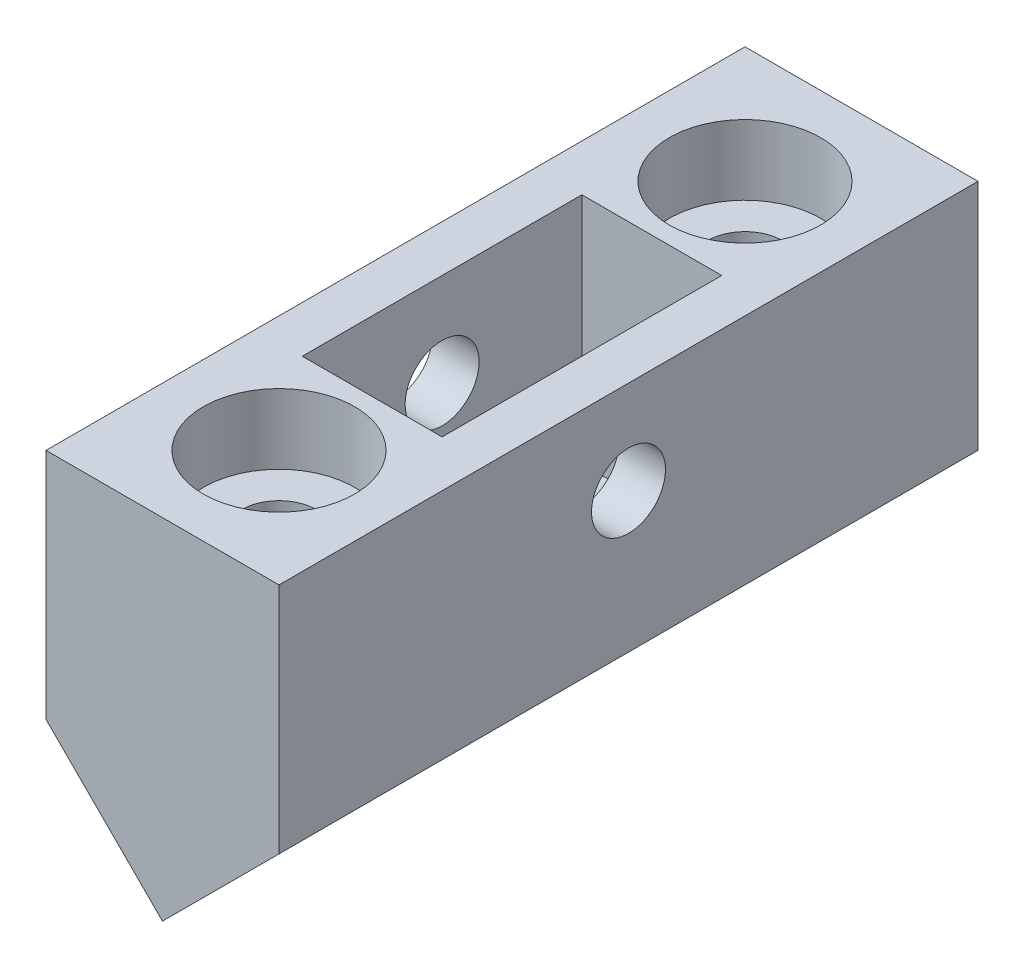
ISO-10303-21;
HEADER;
FILE_DESCRIPTION(('STEP AP214'),'2;1');
FILE_NAME('part.step','',(''),(''),'','','');
FILE_SCHEMA(('AUTOMOTIVE_DESIGN { 1 0 10303 214 1 1 1 1 }'));
ENDSEC;
DATA;
#1=APPLICATION_CONTEXT('core data for automotive mechanical design processes');
#2=APPLICATION_PROTOCOL_DEFINITION('international standard','automotive_design',2000,#1);
#3=PRODUCT_CONTEXT('',#1,'mechanical');
#4=PRODUCT('Part','Part','',(#3));
#5=PRODUCT_RELATED_PRODUCT_CATEGORY('part','',(#4));
#6=PRODUCT_DEFINITION_FORMATION('','',#4);
#7=PRODUCT_DEFINITION_CONTEXT('part definition',#1,'design');
#8=PRODUCT_DEFINITION('design','',#6,#7);
#9=PRODUCT_DEFINITION_SHAPE('','',#8);
#10=(LENGTH_UNIT() NAMED_UNIT(*) SI_UNIT(.MILLI.,.METRE.));
#11=(NAMED_UNIT(*) PLANE_ANGLE_UNIT() SI_UNIT($,.RADIAN.));
#12=(NAMED_UNIT(*) SI_UNIT($,.STERADIAN.) SOLID_ANGLE_UNIT());
#13=UNCERTAINTY_MEASURE_WITH_UNIT(LENGTH_MEASURE(1.E-05),#10,'distance_accuracy_value','');
#14=(GEOMETRIC_REPRESENTATION_CONTEXT(3) GLOBAL_UNCERTAINTY_ASSIGNED_CONTEXT((#13)) GLOBAL_UNIT_ASSIGNED_CONTEXT((#10,
#11,#12)) REPRESENTATION_CONTEXT('',''));
#15=CARTESIAN_POINT('',(0.,0.,0.));
#16=DIRECTION('',(0.,0.,1.));
#17=DIRECTION('',(1.,0.,0.));
#18=AXIS2_PLACEMENT_3D('',#15,#16,#17);
#19=CARTESIAN_POINT('',(0.,-10.,-15.));
#20=DIRECTION('',(0.707106781186549,-0.707106781186547,0.));
#21=DIRECTION('',(0.707106781186547,0.707106781186549,0.));
#22=AXIS2_PLACEMENT_3D('',#19,#20,#21);
#23=PLANE('',#22);
#24=CARTESIAN_POINT('',(0.,-10.,10.));
#25=DIRECTION('',(0.707106781186549,-0.707106781186547,0.));
#26=DIRECTION('',(0.707106781186547,0.707106781186549,0.));
#27=AXIS2_PLACEMENT_3D('',#24,#25,#26);
#28=ELLIPSE('',#27,2.26274169979695,1.6);
#29=CARTESIAN_POINT('',(0.,-10.,8.4));
#30=VERTEX_POINT('',#29);
#31=CARTESIAN_POINT('',(0.,-10.,11.6));
#32=VERTEX_POINT('',#31);
#33=EDGE_CURVE('E47',#30,#32,#28,.T.);
#34=ORIENTED_EDGE('',*,*,#33,.F.);
#35=DIRECTION('',(0.,0.,1.));
#36=VECTOR('',#35,1.);
#37=CARTESIAN_POINT('',(0.,-10.,-15.));
#38=LINE('',#37,#36);
#39=CARTESIAN_POINT('',(0.,-10.,-8.4));
#40=VERTEX_POINT('',#39);
#41=EDGE_CURVE('E120',#40,#30,#38,.T.);
#42=ORIENTED_EDGE('',*,*,#41,.F.);
#43=CARTESIAN_POINT('',(0.,-10.,-10.));
#44=DIRECTION('',(0.707106781186549,-0.707106781186547,0.));
#45=DIRECTION('',(0.707106781186547,0.707106781186549,0.));
#46=AXIS2_PLACEMENT_3D('',#43,#44,#45);
#47=ELLIPSE('',#46,2.26274169979695,1.6);
#48=CARTESIAN_POINT('',(0.,-10.,-11.6));
#49=VERTEX_POINT('',#48);
#50=EDGE_CURVE('E42',#49,#40,#47,.T.);
#51=ORIENTED_EDGE('',*,*,#50,.F.);
#52=CARTESIAN_POINT('',(0.,-10.,-15.));
#53=VERTEX_POINT('',#52);
#54=EDGE_CURVE('E128',#53,#49,#38,.T.);
#55=ORIENTED_EDGE('',*,*,#54,.F.);
#56=DIRECTION('',(0.707106781186547,0.707106781186549,0.));
#57=VECTOR('',#56,1.);
#58=CARTESIAN_POINT('',(0.,-10.,-15.));
#59=LINE('',#58,#57);
#60=CARTESIAN_POINT('',(5.,-5.,-15.));
#61=VERTEX_POINT('',#60);
#62=EDGE_CURVE('E165',#53,#61,#59,.T.);
#63=ORIENTED_EDGE('',*,*,#62,.T.);
#64=DIRECTION('',(0.,0.,1.));
#65=VECTOR('',#64,1.);
#66=CARTESIAN_POINT('',(5.,-5.,-15.));
#67=LINE('',#66,#65);
#68=CARTESIAN_POINT('',(5.,-5.,15.));
#69=VERTEX_POINT('',#68);
#70=EDGE_CURVE('E140',#61,#69,#67,.T.);
#71=ORIENTED_EDGE('',*,*,#70,.T.);
#72=DIRECTION('',(0.707106781186547,0.707106781186549,0.));
#73=VECTOR('',#72,1.);
#74=CARTESIAN_POINT('',(0.,-10.,15.));
#75=LINE('',#74,#73);
#76=CARTESIAN_POINT('',(0.,-10.,15.));
#77=VERTEX_POINT('',#76);
#78=EDGE_CURVE('E179',#77,#69,#75,.T.);
#79=ORIENTED_EDGE('',*,*,#78,.F.);
#80=EDGE_CURVE('E122',#32,#77,#38,.T.);
#81=ORIENTED_EDGE('',*,*,#80,.F.);
#82=EDGE_LOOP('',(#34,#42,#51,#55,#63,#71,#79,#81));
#83=FACE_BOUND('',#82,.T.);
#84=ADVANCED_FACE('F35',(#83),#23,.T.);
#85=CARTESIAN_POINT('',(-5.,-5.,-15.));
#86=DIRECTION('',(-0.707106781186548,-0.707106781186547,0.));
#87=DIRECTION('',(0.707106781186547,-0.707106781186548,0.));
#88=AXIS2_PLACEMENT_3D('',#85,#86,#87);
#89=PLANE('',#88);
#90=CARTESIAN_POINT('',(0.,-10.,10.));
#91=DIRECTION('',(-0.707106781186548,-0.707106781186547,0.));
#92=DIRECTION('',(-0.707106781186547,0.707106781186548,0.));
#93=AXIS2_PLACEMENT_3D('',#90,#91,#92);
#94=ELLIPSE('',#93,2.26274169979695,1.6);
#95=EDGE_CURVE('E11',#32,#30,#94,.T.);
#96=ORIENTED_EDGE('',*,*,#95,.F.);
#97=ORIENTED_EDGE('',*,*,#80,.T.);
#98=DIRECTION('',(0.707106781186547,-0.707106781186548,0.));
#99=VECTOR('',#98,1.);
#100=CARTESIAN_POINT('',(-5.,-5.,15.));
#101=LINE('',#100,#99);
#102=CARTESIAN_POINT('',(-5.,-5.,15.));
#103=VERTEX_POINT('',#102);
#104=EDGE_CURVE('E167',#103,#77,#101,.T.);
#105=ORIENTED_EDGE('',*,*,#104,.F.);
#106=DIRECTION('',(0.,0.,1.));
#107=VECTOR('',#106,1.);
#108=CARTESIAN_POINT('',(-5.,-5.,-15.));
#109=LINE('',#108,#107);
#110=CARTESIAN_POINT('',(-5.,-5.,-15.));
#111=VERTEX_POINT('',#110);
#112=EDGE_CURVE('E130',#111,#103,#109,.T.);
#113=ORIENTED_EDGE('',*,*,#112,.F.);
#114=DIRECTION('',(0.707106781186547,-0.707106781186548,0.));
#115=VECTOR('',#114,1.);
#116=CARTESIAN_POINT('',(-5.,-5.,-15.));
#117=LINE('',#116,#115);
#118=EDGE_CURVE('E133',#111,#53,#117,.T.);
#119=ORIENTED_EDGE('',*,*,#118,.T.);
#120=ORIENTED_EDGE('',*,*,#54,.T.);
#121=CARTESIAN_POINT('',(0.,-10.,-10.));
#122=DIRECTION('',(-0.707106781186548,-0.707106781186547,0.));
#123=DIRECTION('',(-0.707106781186547,0.707106781186548,0.));
#124=AXIS2_PLACEMENT_3D('',#121,#122,#123);
#125=ELLIPSE('',#124,2.26274169979695,1.6);
#126=EDGE_CURVE('E54',#40,#49,#125,.T.);
#127=ORIENTED_EDGE('',*,*,#126,.F.);
#128=ORIENTED_EDGE('',*,*,#41,.T.);
#129=EDGE_LOOP('',(#96,#97,#105,#113,#119,#120,#127,#128));
#130=FACE_BOUND('',#129,.T.);
#131=ADVANCED_FACE('F126',(#130),#89,.T.);
#132=CARTESIAN_POINT('',(-5.,5.,-15.));
#133=DIRECTION('',(-1.,0.,0.));
#134=DIRECTION('',(0.,0.,1.));
#135=AXIS2_PLACEMENT_3D('',#132,#133,#134);
#136=PLANE('',#135);
#137=CARTESIAN_POINT('',(-5.,1.,0.));
#138=DIRECTION('',(1.,0.,0.));
#139=DIRECTION('',(0.,1.,0.));
#140=AXIS2_PLACEMENT_3D('',#137,#138,#139);
#141=CIRCLE('',#140,1.5875);
#142=CARTESIAN_POINT('',(-5.,2.5875,0.));
#143=VERTEX_POINT('',#142);
#144=EDGE_CURVE('E145',#143,#143,#141,.T.);
#145=ORIENTED_EDGE('',*,*,#144,.T.);
#146=EDGE_LOOP('',(#145));
#147=FACE_BOUND('',#146,.T.);
#148=ORIENTED_EDGE('',*,*,#112,.T.);
#149=DIRECTION('',(0.,-1.,0.));
#150=VECTOR('',#149,1.);
#151=CARTESIAN_POINT('',(-5.,5.,15.));
#152=LINE('',#151,#150);
#153=CARTESIAN_POINT('',(-5.,5.,15.));
#154=VERTEX_POINT('',#153);
#155=EDGE_CURVE('E170',#154,#103,#152,.T.);
#156=ORIENTED_EDGE('',*,*,#155,.F.);
#157=DIRECTION('',(0.,0.,1.));
#158=VECTOR('',#157,1.);
#159=CARTESIAN_POINT('',(-5.,5.,-15.));
#160=LINE('',#159,#158);
#161=CARTESIAN_POINT('',(-5.,5.,-15.));
#162=VERTEX_POINT('',#161);
#163=EDGE_CURVE('E136',#162,#154,#160,.T.);
#164=ORIENTED_EDGE('',*,*,#163,.F.);
#165=DIRECTION('',(0.,-1.,0.));
#166=VECTOR('',#165,1.);
#167=CARTESIAN_POINT('',(-5.,5.,-15.));
#168=LINE('',#167,#166);
#169=EDGE_CURVE('E156',#162,#111,#168,.T.);
#170=ORIENTED_EDGE('',*,*,#169,.T.);
#171=EDGE_LOOP('',(#148,#156,#164,#170));
#172=FACE_BOUND('',#171,.T.);
#173=ADVANCED_FACE('F245',(#147,#172),#136,.T.);
#174=CARTESIAN_POINT('',(-5.,5.,-15.));
#175=DIRECTION('',(0.,1.,0.));
#176=DIRECTION('',(-1.,0.,0.));
#177=AXIS2_PLACEMENT_3D('',#174,#175,#176);
#178=PLANE('',#177);
#179=CARTESIAN_POINT('',(0.,5.,10.));
#180=DIRECTION('',(0.,1.,0.));
#181=DIRECTION('',(0.,0.,1.));
#182=AXIS2_PLACEMENT_3D('',#179,#180,#181);
#183=CIRCLE('',#182,3.25);
#184=CARTESIAN_POINT('',(0.,5.,13.25));
#185=VERTEX_POINT('',#184);
#186=EDGE_CURVE('E235',#185,#185,#183,.T.);
#187=ORIENTED_EDGE('',*,*,#186,.F.);
#188=EDGE_LOOP('',(#187));
#189=FACE_BOUND('',#188,.T.);
#190=CARTESIAN_POINT('',(0.,5.,-10.));
#191=DIRECTION('',(0.,1.,0.));
#192=DIRECTION('',(0.,0.,1.));
#193=AXIS2_PLACEMENT_3D('',#190,#191,#192);
#194=CIRCLE('',#193,3.25);
#195=CARTESIAN_POINT('',(0.,5.,-6.75));
#196=VERTEX_POINT('',#195);
#197=EDGE_CURVE('E123',#196,#196,#194,.T.);
#198=ORIENTED_EDGE('',*,*,#197,.F.);
#199=EDGE_LOOP('',(#198));
#200=FACE_BOUND('',#199,.T.);
#201=DIRECTION('',(0.,0.,-1.));
#202=VECTOR('',#201,1.);
#203=CARTESIAN_POINT('',(3.,5.00000000000001,-6.));
#204=LINE('',#203,#202);
#205=CARTESIAN_POINT('',(3.,5.00000000000001,6.));
#206=VERTEX_POINT('',#205);
#207=CARTESIAN_POINT('',(3.00000000000001,5.,-6.));
#208=VERTEX_POINT('',#207);
#209=EDGE_CURVE('E202',#206,#208,#204,.T.);
#210=ORIENTED_EDGE('',*,*,#209,.F.);
#211=DIRECTION('',(1.,0.,0.));
#212=VECTOR('',#211,1.);
#213=CARTESIAN_POINT('',(-3.,5.,6.));
#214=LINE('',#213,#212);
#215=CARTESIAN_POINT('',(-3.,5.,6.));
#216=VERTEX_POINT('',#215);
#217=EDGE_CURVE('E192',#216,#206,#214,.T.);
#218=ORIENTED_EDGE('',*,*,#217,.F.);
#219=DIRECTION('',(0.,0.,1.));
#220=VECTOR('',#219,1.);
#221=CARTESIAN_POINT('',(-3.,5.,-6.));
#222=LINE('',#221,#220);
#223=CARTESIAN_POINT('',(-3.,5.,-6.));
#224=VERTEX_POINT('',#223);
#225=EDGE_CURVE('E196',#224,#216,#222,.T.);
#226=ORIENTED_EDGE('',*,*,#225,.F.);
#227=DIRECTION('',(-1.,0.,0.));
#228=VECTOR('',#227,1.);
#229=CARTESIAN_POINT('',(-3.,5.,-6.));
#230=LINE('',#229,#228);
#231=EDGE_CURVE('E199',#208,#224,#230,.T.);
#232=ORIENTED_EDGE('',*,*,#231,.F.);
#233=EDGE_LOOP('',(#210,#218,#226,#232));
#234=FACE_BOUND('',#233,.T.);
#235=ORIENTED_EDGE('',*,*,#163,.T.);
#236=DIRECTION('',(-1.,0.,0.));
#237=VECTOR('',#236,1.);
#238=CARTESIAN_POINT('',(-5.,5.,15.));
#239=LINE('',#238,#237);
#240=CARTESIAN_POINT('',(5.,5.,15.));
#241=VERTEX_POINT('',#240);
#242=EDGE_CURVE('E173',#241,#154,#239,.T.);
#243=ORIENTED_EDGE('',*,*,#242,.F.);
#244=DIRECTION('',(0.,0.,1.));
#245=VECTOR('',#244,1.);
#246=CARTESIAN_POINT('',(5.,5.,-15.));
#247=LINE('',#246,#245);
#248=CARTESIAN_POINT('',(5.,5.,-15.));
#249=VERTEX_POINT('',#248);
#250=EDGE_CURVE('E138',#249,#241,#247,.T.);
#251=ORIENTED_EDGE('',*,*,#250,.F.);
#252=DIRECTION('',(-1.,0.,0.));
#253=VECTOR('',#252,1.);
#254=CARTESIAN_POINT('',(-5.,5.,-15.));
#255=LINE('',#254,#253);
#256=EDGE_CURVE('E157',#249,#162,#255,.T.);
#257=ORIENTED_EDGE('',*,*,#256,.T.);
#258=EDGE_LOOP('',(#235,#243,#251,#257));
#259=FACE_BOUND('',#258,.T.);
#260=ADVANCED_FACE('F241',(#189,#200,#234,#259),#178,.T.);
#261=CARTESIAN_POINT('',(5.,5.,-15.));
#262=DIRECTION('',(1.,0.,0.));
#263=DIRECTION('',(0.,0.,-1.));
#264=AXIS2_PLACEMENT_3D('',#261,#262,#263);
#265=PLANE('',#264);
#266=CARTESIAN_POINT('',(5.,1.,0.));
#267=DIRECTION('',(1.,0.,0.));
#268=DIRECTION('',(0.,1.,0.));
#269=AXIS2_PLACEMENT_3D('',#266,#267,#268);
#270=CIRCLE('',#269,1.5875);
#271=CARTESIAN_POINT('',(5.,2.5875,0.));
#272=VERTEX_POINT('',#271);
#273=EDGE_CURVE('E216',#272,#272,#270,.T.);
#274=ORIENTED_EDGE('',*,*,#273,.F.);
#275=EDGE_LOOP('',(#274));
#276=FACE_BOUND('',#275,.T.);
#277=ORIENTED_EDGE('',*,*,#250,.T.);
#278=DIRECTION('',(0.,1.,0.));
#279=VECTOR('',#278,1.);
#280=CARTESIAN_POINT('',(5.,5.,15.));
#281=LINE('',#280,#279);
#282=EDGE_CURVE('E176',#69,#241,#281,.T.);
#283=ORIENTED_EDGE('',*,*,#282,.F.);
#284=ORIENTED_EDGE('',*,*,#70,.F.);
#285=DIRECTION('',(0.,1.,0.));
#286=VECTOR('',#285,1.);
#287=CARTESIAN_POINT('',(5.,5.,-15.));
#288=LINE('',#287,#286);
#289=EDGE_CURVE('E160',#61,#249,#288,.T.);
#290=ORIENTED_EDGE('',*,*,#289,.T.);
#291=EDGE_LOOP('',(#277,#283,#284,#290));
#292=FACE_BOUND('',#291,.T.);
#293=ADVANCED_FACE('F244',(#276,#292),#265,.T.);
#294=CARTESIAN_POINT('',(0.,0.,-15.));
#295=DIRECTION('',(0.,0.,-1.));
#296=DIRECTION('',(-1.,0.,0.));
#297=AXIS2_PLACEMENT_3D('',#294,#295,#296);
#298=PLANE('',#297);
#299=ORIENTED_EDGE('',*,*,#62,.F.);
#300=ORIENTED_EDGE('',*,*,#118,.F.);
#301=ORIENTED_EDGE('',*,*,#169,.F.);
#302=ORIENTED_EDGE('',*,*,#256,.F.);
#303=ORIENTED_EDGE('',*,*,#289,.F.);
#304=EDGE_LOOP('',(#299,#300,#301,#302,#303));
#305=FACE_BOUND('',#304,.T.);
#306=ADVANCED_FACE('F372',(#305),#298,.T.);
#307=CARTESIAN_POINT('',(0.,0.,15.));
#308=DIRECTION('',(0.,0.,-1.));
#309=DIRECTION('',(-1.,0.,0.));
#310=AXIS2_PLACEMENT_3D('',#307,#308,#309);
#311=PLANE('',#310);
#312=ORIENTED_EDGE('',*,*,#78,.T.);
#313=ORIENTED_EDGE('',*,*,#282,.T.);
#314=ORIENTED_EDGE('',*,*,#242,.T.);
#315=ORIENTED_EDGE('',*,*,#155,.T.);
#316=ORIENTED_EDGE('',*,*,#104,.T.);
#317=EDGE_LOOP('',(#312,#313,#314,#315,#316));
#318=FACE_BOUND('',#317,.T.);
#319=ADVANCED_FACE('F257',(#318),#311,.F.);
#320=CARTESIAN_POINT('',(3.00000000000001,-4.99999999999999,-6.));
#321=DIRECTION('',(1.,0.,0.));
#322=DIRECTION('',(0.,1.,0.));
#323=AXIS2_PLACEMENT_3D('',#320,#321,#322);
#324=PLANE('',#323);
#325=CARTESIAN_POINT('',(3.,1.,0.));
#326=DIRECTION('',(1.,0.,0.));
#327=DIRECTION('',(0.,1.,0.));
#328=AXIS2_PLACEMENT_3D('',#325,#326,#327);
#329=CIRCLE('',#328,1.5875);
#330=CARTESIAN_POINT('',(3.,2.5875,0.));
#331=VERTEX_POINT('',#330);
#332=EDGE_CURVE('E144',#331,#331,#329,.T.);
#333=ORIENTED_EDGE('',*,*,#332,.T.);
#334=EDGE_LOOP('',(#333));
#335=FACE_BOUND('',#334,.T.);
#336=ORIENTED_EDGE('',*,*,#209,.T.);
#337=DIRECTION('',(0.,1.,0.));
#338=VECTOR('',#337,1.);
#339=CARTESIAN_POINT('',(3.00000000000001,-4.99999999999999,-6.));
#340=LINE('',#339,#338);
#341=CARTESIAN_POINT('',(3.00000000000001,-4.99999999999999,-6.));
#342=VERTEX_POINT('',#341);
#343=EDGE_CURVE('E183',#342,#208,#340,.T.);
#344=ORIENTED_EDGE('',*,*,#343,.F.);
#345=DIRECTION('',(0.,0.,-1.));
#346=VECTOR('',#345,1.);
#347=CARTESIAN_POINT('',(3.00000000000001,-4.99999999999999,-6.));
#348=LINE('',#347,#346);
#349=CARTESIAN_POINT('',(3.00000000000001,-4.99999999999999,6.));
#350=VERTEX_POINT('',#349);
#351=EDGE_CURVE('E195',#350,#342,#348,.T.);
#352=ORIENTED_EDGE('',*,*,#351,.F.);
#353=DIRECTION('',(0.,1.,0.));
#354=VECTOR('',#353,1.);
#355=CARTESIAN_POINT('',(3.00000000000001,-4.99999999999999,6.));
#356=LINE('',#355,#354);
#357=EDGE_CURVE('E182',#350,#206,#356,.T.);
#358=ORIENTED_EDGE('',*,*,#357,.T.);
#359=EDGE_LOOP('',(#336,#344,#352,#358));
#360=FACE_BOUND('',#359,.T.);
#361=ADVANCED_FACE('F359',(#335,#360),#324,.F.);
#362=CARTESIAN_POINT('',(-2.99999999999999,-5.,6.));
#363=DIRECTION('',(0.,0.,1.));
#364=DIRECTION('',(1.,0.,0.));
#365=AXIS2_PLACEMENT_3D('',#362,#363,#364);
#366=PLANE('',#365);
#367=ORIENTED_EDGE('',*,*,#217,.T.);
#368=ORIENTED_EDGE('',*,*,#357,.F.);
#369=DIRECTION('',(1.,0.,0.));
#370=VECTOR('',#369,1.);
#371=CARTESIAN_POINT('',(-2.99999999999999,-5.,6.));
#372=LINE('',#371,#370);
#373=CARTESIAN_POINT('',(-2.99999999999999,-5.,6.));
#374=VERTEX_POINT('',#373);
#375=EDGE_CURVE('E187',#374,#350,#372,.T.);
#376=ORIENTED_EDGE('',*,*,#375,.F.);
#377=DIRECTION('',(0.,1.,0.));
#378=VECTOR('',#377,1.);
#379=CARTESIAN_POINT('',(-2.99999999999999,-5.,6.));
#380=LINE('',#379,#378);
#381=EDGE_CURVE('E189',#374,#216,#380,.T.);
#382=ORIENTED_EDGE('',*,*,#381,.T.);
#383=EDGE_LOOP('',(#367,#368,#376,#382));
#384=FACE_BOUND('',#383,.T.);
#385=ADVANCED_FACE('F355',(#384),#366,.F.);
#386=CARTESIAN_POINT('',(-2.99999999999999,-5.,-6.));
#387=DIRECTION('',(-1.,0.,0.));
#388=DIRECTION('',(0.,-1.,0.));
#389=AXIS2_PLACEMENT_3D('',#386,#387,#388);
#390=PLANE('',#389);
#391=CARTESIAN_POINT('',(-3.,1.,0.));
#392=DIRECTION('',(-1.,0.,0.));
#393=DIRECTION('',(0.,-1.,0.));
#394=AXIS2_PLACEMENT_3D('',#391,#392,#393);
#395=CIRCLE('',#394,1.5875);
#396=CARTESIAN_POINT('',(-2.99999999999999,-0.587499999999997,0.));
#397=VERTEX_POINT('',#396);
#398=EDGE_CURVE('E142',#397,#397,#395,.T.);
#399=ORIENTED_EDGE('',*,*,#398,.T.);
#400=EDGE_LOOP('',(#399));
#401=FACE_BOUND('',#400,.T.);
#402=ORIENTED_EDGE('',*,*,#225,.T.);
#403=ORIENTED_EDGE('',*,*,#381,.F.);
#404=DIRECTION('',(0.,0.,1.));
#405=VECTOR('',#404,1.);
#406=CARTESIAN_POINT('',(-2.99999999999999,-5.,-6.));
#407=LINE('',#406,#405);
#408=CARTESIAN_POINT('',(-2.99999999999999,-5.,-6.));
#409=VERTEX_POINT('',#408);
#410=EDGE_CURVE('E206',#409,#374,#407,.T.);
#411=ORIENTED_EDGE('',*,*,#410,.F.);
#412=DIRECTION('',(0.,1.,0.));
#413=VECTOR('',#412,1.);
#414=CARTESIAN_POINT('',(-2.99999999999999,-5.,-6.));
#415=LINE('',#414,#413);
#416=EDGE_CURVE('E186',#409,#224,#415,.T.);
#417=ORIENTED_EDGE('',*,*,#416,.T.);
#418=EDGE_LOOP('',(#402,#403,#411,#417));
#419=FACE_BOUND('',#418,.T.);
#420=ADVANCED_FACE('F358',(#401,#419),#390,.F.);
#421=CARTESIAN_POINT('',(-2.99999999999999,-5.,-6.));
#422=DIRECTION('',(0.,0.,-1.));
#423=DIRECTION('',(-1.,0.,0.));
#424=AXIS2_PLACEMENT_3D('',#421,#422,#423);
#425=PLANE('',#424);
#426=ORIENTED_EDGE('',*,*,#231,.T.);
#427=ORIENTED_EDGE('',*,*,#416,.F.);
#428=DIRECTION('',(-1.,0.,0.));
#429=VECTOR('',#428,1.);
#430=CARTESIAN_POINT('',(-2.99999999999999,-5.,-6.));
#431=LINE('',#430,#429);
#432=EDGE_CURVE('E209',#342,#409,#431,.T.);
#433=ORIENTED_EDGE('',*,*,#432,.F.);
#434=ORIENTED_EDGE('',*,*,#343,.T.);
#435=EDGE_LOOP('',(#426,#427,#433,#434));
#436=FACE_BOUND('',#435,.T.);
#437=ADVANCED_FACE('F353',(#436),#425,.F.);
#438=CARTESIAN_POINT('',(0.,-5.,0.));
#439=DIRECTION('',(0.,1.,0.));
#440=DIRECTION('',(-1.,0.,0.));
#441=AXIS2_PLACEMENT_3D('',#438,#439,#440);
#442=PLANE('',#441);
#443=ORIENTED_EDGE('',*,*,#351,.T.);
#444=ORIENTED_EDGE('',*,*,#432,.T.);
#445=ORIENTED_EDGE('',*,*,#410,.T.);
#446=ORIENTED_EDGE('',*,*,#375,.T.);
#447=EDGE_LOOP('',(#443,#444,#445,#446));
#448=FACE_BOUND('',#447,.T.);
#449=ADVANCED_FACE('F350',(#448),#442,.T.);
#450=CARTESIAN_POINT('',(-5.,1.,0.));
#451=DIRECTION('',(1.,0.,0.));
#452=DIRECTION('',(0.,1.,0.));
#453=AXIS2_PLACEMENT_3D('',#450,#451,#452);
#454=CYLINDRICAL_SURFACE('',#453,1.5875);
#455=ORIENTED_EDGE('',*,*,#144,.F.);
#456=EDGE_LOOP('',(#455));
#457=FACE_BOUND('',#456,.T.);
#458=ORIENTED_EDGE('',*,*,#398,.F.);
#459=EDGE_LOOP('',(#458));
#460=FACE_BOUND('',#459,.T.);
#461=ADVANCED_FACE('F348',(#457,#460),#454,.F.);
#462=ORIENTED_EDGE('',*,*,#273,.T.);
#463=EDGE_LOOP('',(#462));
#464=FACE_BOUND('',#463,.T.);
#465=ORIENTED_EDGE('',*,*,#332,.F.);
#466=EDGE_LOOP('',(#465));
#467=FACE_BOUND('',#466,.T.);
#468=ADVANCED_FACE('F293',(#464,#467),#454,.F.);
#469=CARTESIAN_POINT('',(0.,5.,-10.));
#470=DIRECTION('',(0.,1.,0.));
#471=DIRECTION('',(0.,0.,1.));
#472=AXIS2_PLACEMENT_3D('',#469,#470,#471);
#473=CYLINDRICAL_SURFACE('',#472,1.6);
#474=ORIENTED_EDGE('',*,*,#126,.T.);
#475=ORIENTED_EDGE('',*,*,#50,.T.);
#476=EDGE_LOOP('',(#474,#475));
#477=FACE_BOUND('',#476,.T.);
#478=CARTESIAN_POINT('',(0.,2.,-10.));
#479=DIRECTION('',(0.,1.,0.));
#480=DIRECTION('',(0.,0.,1.));
#481=AXIS2_PLACEMENT_3D('',#478,#479,#480);
#482=CIRCLE('',#481,1.6);
#483=CARTESIAN_POINT('',(0.,2.,-8.4));
#484=VERTEX_POINT('',#483);
#485=EDGE_CURVE('E222',#484,#484,#482,.T.);
#486=ORIENTED_EDGE('',*,*,#485,.T.);
#487=EDGE_LOOP('',(#486));
#488=FACE_BOUND('',#487,.T.);
#489=ADVANCED_FACE('F146',(#477,#488),#473,.F.);
#490=CARTESIAN_POINT('',(1.6,2.,-10.));
#491=DIRECTION('',(0.,-1.,0.));
#492=DIRECTION('',(0.,0.,-1.));
#493=AXIS2_PLACEMENT_3D('',#490,#491,#492);
#494=PLANE('',#493);
#495=ORIENTED_EDGE('',*,*,#485,.F.);
#496=EDGE_LOOP('',(#495));
#497=FACE_BOUND('',#496,.T.);
#498=CARTESIAN_POINT('',(0.,2.,-10.));
#499=DIRECTION('',(0.,1.,0.));
#500=DIRECTION('',(0.,0.,1.));
#501=AXIS2_PLACEMENT_3D('',#498,#499,#500);
#502=CIRCLE('',#501,3.25);
#503=CARTESIAN_POINT('',(0.,2.,-6.75));
#504=VERTEX_POINT('',#503);
#505=EDGE_CURVE('E225',#504,#504,#502,.T.);
#506=ORIENTED_EDGE('',*,*,#505,.T.);
#507=EDGE_LOOP('',(#506));
#508=FACE_BOUND('',#507,.T.);
#509=ADVANCED_FACE('F292',(#497,#508),#494,.F.);
#510=CARTESIAN_POINT('',(0.,5.,-10.));
#511=DIRECTION('',(0.,1.,0.));
#512=DIRECTION('',(0.,0.,1.));
#513=AXIS2_PLACEMENT_3D('',#510,#511,#512);
#514=CYLINDRICAL_SURFACE('',#513,3.25);
#515=ORIENTED_EDGE('',*,*,#505,.F.);
#516=EDGE_LOOP('',(#515));
#517=FACE_BOUND('',#516,.T.);
#518=ORIENTED_EDGE('',*,*,#197,.T.);
#519=EDGE_LOOP('',(#518));
#520=FACE_BOUND('',#519,.T.);
#521=ADVANCED_FACE('F304',(#517,#520),#514,.F.);
#522=CARTESIAN_POINT('',(0.,5.,10.));
#523=DIRECTION('',(0.,1.,0.));
#524=DIRECTION('',(0.,0.,1.));
#525=AXIS2_PLACEMENT_3D('',#522,#523,#524);
#526=CYLINDRICAL_SURFACE('',#525,1.6);
#527=ORIENTED_EDGE('',*,*,#33,.T.);
#528=ORIENTED_EDGE('',*,*,#95,.T.);
#529=EDGE_LOOP('',(#527,#528));
#530=FACE_BOUND('',#529,.T.);
#531=CARTESIAN_POINT('',(0.,2.,10.));
#532=DIRECTION('',(0.,1.,0.));
#533=DIRECTION('',(0.,0.,1.));
#534=AXIS2_PLACEMENT_3D('',#531,#532,#533);
#535=CIRCLE('',#534,1.6);
#536=CARTESIAN_POINT('',(0.,2.,11.6));
#537=VERTEX_POINT('',#536);
#538=EDGE_CURVE('E124',#537,#537,#535,.T.);
#539=ORIENTED_EDGE('',*,*,#538,.T.);
#540=EDGE_LOOP('',(#539));
#541=FACE_BOUND('',#540,.T.);
#542=ADVANCED_FACE('F113',(#530,#541),#526,.F.);
#543=CARTESIAN_POINT('',(1.6,2.,10.));
#544=DIRECTION('',(0.,-1.,0.));
#545=DIRECTION('',(0.,0.,-1.));
#546=AXIS2_PLACEMENT_3D('',#543,#544,#545);
#547=PLANE('',#546);
#548=ORIENTED_EDGE('',*,*,#538,.F.);
#549=EDGE_LOOP('',(#548));
#550=FACE_BOUND('',#549,.T.);
#551=CARTESIAN_POINT('',(0.,2.,10.));
#552=DIRECTION('',(0.,1.,0.));
#553=DIRECTION('',(0.,0.,1.));
#554=AXIS2_PLACEMENT_3D('',#551,#552,#553);
#555=CIRCLE('',#554,3.25);
#556=CARTESIAN_POINT('',(0.,2.,13.25));
#557=VERTEX_POINT('',#556);
#558=EDGE_CURVE('E232',#557,#557,#555,.T.);
#559=ORIENTED_EDGE('',*,*,#558,.T.);
#560=EDGE_LOOP('',(#559));
#561=FACE_BOUND('',#560,.T.);
#562=ADVANCED_FACE('F323',(#550,#561),#547,.F.);
#563=CARTESIAN_POINT('',(0.,5.,10.));
#564=DIRECTION('',(0.,1.,0.));
#565=DIRECTION('',(0.,0.,1.));
#566=AXIS2_PLACEMENT_3D('',#563,#564,#565);
#567=CYLINDRICAL_SURFACE('',#566,3.25);
#568=ORIENTED_EDGE('',*,*,#558,.F.);
#569=EDGE_LOOP('',(#568));
#570=FACE_BOUND('',#569,.T.);
#571=ORIENTED_EDGE('',*,*,#186,.T.);
#572=EDGE_LOOP('',(#571));
#573=FACE_BOUND('',#572,.T.);
#574=ADVANCED_FACE('F239',(#570,#573),#567,.F.);
#575=CLOSED_SHELL('',(#84,#131,#173,#260,#293,#306,#319,#361,#385,#420,#437,#449,#461,#468,#489,
#509,#521,#542,#562,#574));
#576=MANIFOLD_SOLID_BREP('B2',#575);
#577=ADVANCED_BREP_SHAPE_REPRESENTATION('',(#18,#576),#14);
#578=SHAPE_DEFINITION_REPRESENTATION(#9,#577);
ENDSEC;
END-ISO-10303-21;
